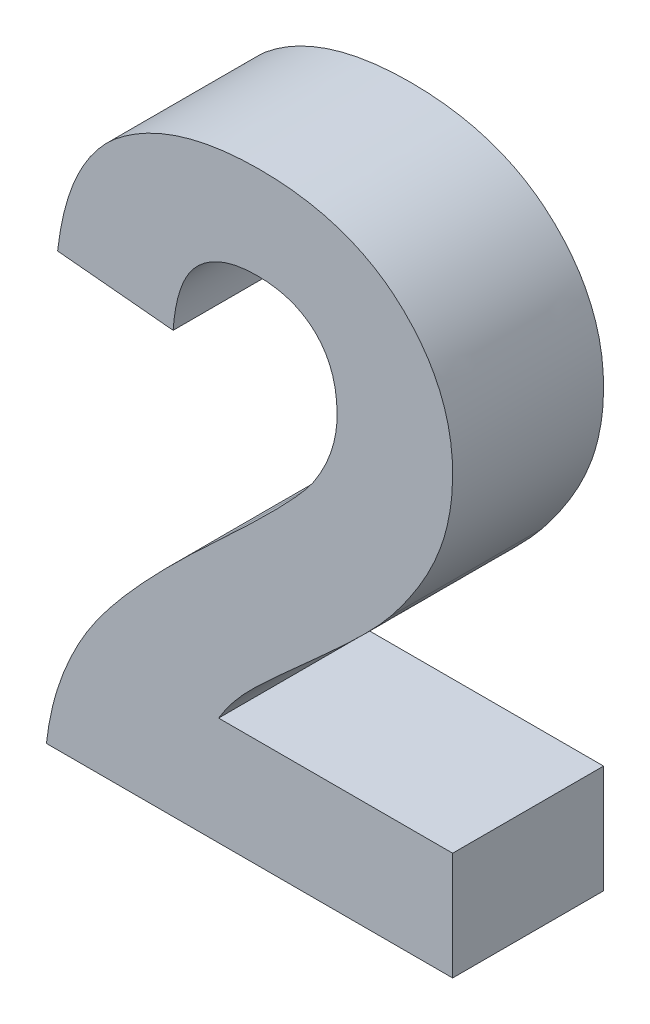
ISO-10303-21;
HEADER;
FILE_DESCRIPTION(('STEP AP214'),'2;1');
FILE_NAME('part.step','',(''),(''),'','','');
FILE_SCHEMA(('AUTOMOTIVE_DESIGN { 1 0 10303 214 1 1 1 1 }'));
ENDSEC;
DATA;
#1=APPLICATION_CONTEXT('core data for automotive mechanical design processes');
#2=APPLICATION_PROTOCOL_DEFINITION('international standard','automotive_design',2000,#1);
#3=PRODUCT_CONTEXT('',#1,'mechanical');
#4=PRODUCT('Part','Part','',(#3));
#5=PRODUCT_RELATED_PRODUCT_CATEGORY('part','',(#4));
#6=PRODUCT_DEFINITION_FORMATION('','',#4);
#7=PRODUCT_DEFINITION_CONTEXT('part definition',#1,'design');
#8=PRODUCT_DEFINITION('design','',#6,#7);
#9=PRODUCT_DEFINITION_SHAPE('','',#8);
#10=(LENGTH_UNIT() NAMED_UNIT(*) SI_UNIT(.MILLI.,.METRE.));
#11=(NAMED_UNIT(*) PLANE_ANGLE_UNIT() SI_UNIT($,.RADIAN.));
#12=(NAMED_UNIT(*) SI_UNIT($,.STERADIAN.) SOLID_ANGLE_UNIT());
#13=UNCERTAINTY_MEASURE_WITH_UNIT(LENGTH_MEASURE(1.E-05),#10,'distance_accuracy_value','');
#14=(GEOMETRIC_REPRESENTATION_CONTEXT(3) GLOBAL_UNCERTAINTY_ASSIGNED_CONTEXT((#13)) GLOBAL_UNIT_ASSIGNED_CONTEXT((#10,
#11,#12)) REPRESENTATION_CONTEXT('',''));
#15=CARTESIAN_POINT('',(0.,0.,0.));
#16=DIRECTION('',(0.,0.,1.));
#17=DIRECTION('',(1.,0.,0.));
#18=AXIS2_PLACEMENT_3D('',#15,#16,#17);
#19=CARTESIAN_POINT('',(-0.36557384071,0.120570176931,0.774985954115));
#20=DIRECTION('',(0.,0.,1.));
#21=DIRECTION('',(1.,0.,0.));
#22=AXIS2_PLACEMENT_3D('',#19,#20,#21);
#23=PLANE('',#22);
#24=DIRECTION('',(0.995540421021157,-0.0943359428479848,0.));
#25=VECTOR('',#24,1.);
#26=CARTESIAN_POINT('',(-0.281623223426,0.39958252261,0.774985954115));
#27=LINE('',#26,#25);
#28=CARTESIAN_POINT('',(-0.281623223426,0.39958252261,0.774985954115));
#29=VERTEX_POINT('',#28);
#30=CARTESIAN_POINT('',(-0.358166433303018,0.406835644351806,0.774985954115));
#31=VERTEX_POINT('',#30);
#32=EDGE_CURVE('E85',#29,#31,#27,.F.);
#33=ORIENTED_EDGE('',*,*,#32,.F.);
#34=CARTESIAN_POINT('',(-0.188876288653,0.35864889653,0.774985954115));
#35=CARTESIAN_POINT('',(-0.185589702861752,0.363542741767973,0.774985954115));
#36=CARTESIAN_POINT('',(-0.182625041832715,0.368731343442548,0.774985954115));
#37=CARTESIAN_POINT('',(-0.17772793674451,0.379545838210944,0.774985954115));
#38=CARTESIAN_POINT('',(-0.175792371443212,0.385170349040421,0.774985954115));
#39=CARTESIAN_POINT('',(-0.173711412476809,0.394893726242337,0.774985954115));
#40=CARTESIAN_POINT('',(-0.173192158147786,0.398907802936944,0.774985954115));
#41=CARTESIAN_POINT('',(-0.172954662833545,0.404944078867293,0.774985954115));
#42=CARTESIAN_POINT('',(-0.17296570515279,0.406958528183745,0.774985954115));
#43=CARTESIAN_POINT('',(-0.173121910214203,0.41098275578545,0.774985954115));
#44=CARTESIAN_POINT('',(-0.173267317941487,0.412992518814079,0.774985954115));
#45=CARTESIAN_POINT('',(-0.174175045306435,0.420897051151495,0.774985954115));
#46=CARTESIAN_POINT('',(-0.175586852863591,0.426769567860373,0.774985954115));
#47=CARTESIAN_POINT('',(-0.180095978161657,0.436584965377426,0.774985954115));
#48=CARTESIAN_POINT('',(-0.182835806045915,0.440684125447488,0.774985954115));
#49=CARTESIAN_POINT('',(-0.189551835271681,0.447699076554615,0.774985954115));
#50=CARTESIAN_POINT('',(-0.193528083964953,0.450614822260067,0.774985954115));
#51=CARTESIAN_POINT('',(-0.202249328406321,0.455094282886834,0.774985954115));
#52=CARTESIAN_POINT('',(-0.207007990791715,0.456630074200257,0.774985954115));
#53=CARTESIAN_POINT('',(-0.216028104793935,0.458385283782089,0.774985954115));
#54=CARTESIAN_POINT('',(-0.220265274570421,0.458759548771318,0.774985954115));
#55=CARTESIAN_POINT('',(-0.228756419771803,0.458901701535633,0.774985954115));
#56=CARTESIAN_POINT('',(-0.233010406561966,0.458669064595302,0.774985954115));
#57=CARTESIAN_POINT('',(-0.240106058682374,0.457597213989227,0.774985954115));
#58=CARTESIAN_POINT('',(-0.242977762173517,0.45696776468392,0.774985954115));
#59=CARTESIAN_POINT('',(-0.248581053737738,0.455256421258504,0.774985954115));
#60=CARTESIAN_POINT('',(-0.25131299520298,0.454175738762386,0.774985954115));
#61=CARTESIAN_POINT('',(-0.256141418358145,0.451724687376708,0.774985954115));
#62=CARTESIAN_POINT('',(-0.258272025804726,0.450421149519848,0.774985954115));
#63=CARTESIAN_POINT('',(-0.262305300863584,0.447500182795881,0.774985954115));
#64=CARTESIAN_POINT('',(-0.264208296394911,0.44588321451327,0.774985954115));
#65=CARTESIAN_POINT('',(-0.267679945346534,0.442310423195121,0.774985954115));
#66=CARTESIAN_POINT('',(-0.269247533536039,0.440353555293841,0.774985954115));
#67=CARTESIAN_POINT('',(-0.272027967175817,0.436203349786996,0.774985954115));
#68=CARTESIAN_POINT('',(-0.273240104938887,0.434009552181115,0.774985954115));
#69=CARTESIAN_POINT('',(-0.27597657660135,0.428173185550849,0.774985954115));
#70=CARTESIAN_POINT('',(-0.277275499397534,0.424427043165281,0.774985954115));
#71=CARTESIAN_POINT('',(-0.27933104714267,0.416789553094169,0.774985954115));
#72=CARTESIAN_POINT('',(-0.280085707400791,0.412897732166158,0.774985954115));
#73=CARTESIAN_POINT('',(-0.281082016095304,0.4058575165382,0.774985954115));
#74=CARTESIAN_POINT('',(-0.281396966366976,0.402719645084862,0.774985954115));
#75=CARTESIAN_POINT('',(-0.281623223426,0.39958252261,0.774985954115));
#76=B_SPLINE_CURVE_WITH_KNOTS('',3,(#34,#35,#36,#37,#38,#39,#40,#41,#42,#43,#44,#45,#46,#47,#48,
#49,#50,#51,#52,#53,#54,#55,#56,#57,#58,#59,#60,#61,#62,#63,#64,#65,#66,#67,#68,#69,#70,#71,#72,
#73,#74,#75),.UNSPECIFIED.,.F.,.F.,(4,2,2,2,2,2,2,2,2,2,2,2,2,2,2,2,2,2,2,2,4),(0.,
0.0177746503934266,0.0354950783032771,0.0475703062707295,0.0536069084304214,0.0596545387401188,
0.0774271803775426,0.0919332203113296,0.106439815857897,0.121233743906381,0.133945558705097,
0.146668367529293,0.155457798148315,0.164223778168004,0.17168828115672,0.179141897131568,
0.186618845002289,0.194110579643022,0.205938754382382,0.217809415875188,0.227255370992188),.UNSPECIFIED.);
#77=CARTESIAN_POINT('',(-0.188876288653,0.35864889653,0.774985954115));
#78=VERTEX_POINT('',#77);
#79=EDGE_CURVE('E142',#78,#29,#76,.T.);
#80=ORIENTED_EDGE('',*,*,#79,.F.);
#81=CARTESIAN_POINT('',(-0.188876288653,0.35864889653,0.774985954115));
#82=CARTESIAN_POINT('',(-0.200643255131,0.341442107584,0.774985954115));
#83=CARTESIAN_POINT('',(-0.252688011161,0.293101074096,0.774985954115));
#84=B_SPLINE_CURVE_WITH_KNOTS('',2,(#81,#82,#83),.UNSPECIFIED.,.F.,.F.,(3,3),(0.,1.),.UNSPECIFIED.);
#85=CARTESIAN_POINT('',(-0.252688011161,0.293101074096,0.774985954115));
#86=VERTEX_POINT('',#85);
#87=EDGE_CURVE('E116',#86,#78,#84,.F.);
#88=ORIENTED_EDGE('',*,*,#87,.F.);
#89=CARTESIAN_POINT('',(-0.36557384071,0.120570176931,0.774985954115));
#90=CARTESIAN_POINT('',(-0.364667384582419,0.129031177894083,0.774985954115));
#91=CARTESIAN_POINT('',(-0.363146663328493,0.13742679075891,0.774985954115));
#92=CARTESIAN_POINT('',(-0.358979270709723,0.153791402215748,0.774985954115));
#93=CARTESIAN_POINT('',(-0.356350965142496,0.161765072144572,0.774985954115));
#94=CARTESIAN_POINT('',(-0.351277857105274,0.174223991575376,0.774985954115));
#95=CARTESIAN_POINT('',(-0.349166790026085,0.178848793473012,0.774985954115));
#96=CARTESIAN_POINT('',(-0.344606821681253,0.187927335487042,0.774985954115));
#97=CARTESIAN_POINT('',(-0.342158091941201,0.192381160996639,0.774985954115));
#98=CARTESIAN_POINT('',(-0.336858255407474,0.201107552759572,0.774985954115));
#99=CARTESIAN_POINT('',(-0.334003144218437,0.205377685943886,0.774985954115));
#100=CARTESIAN_POINT('',(-0.328006443666915,0.213711889106658,0.774985954115));
#101=CARTESIAN_POINT('',(-0.32486466235471,0.21777581813845,0.774985954115));
#102=CARTESIAN_POINT('',(-0.316366205394076,0.22828800497123,0.774985954115));
#103=CARTESIAN_POINT('',(-0.310865431920654,0.234618654551614,0.774985954115));
#104=CARTESIAN_POINT('',(-0.299581933782532,0.247022870345501,0.774985954115));
#105=CARTESIAN_POINT('',(-0.293799114969163,0.253096349432275,0.774985954115));
#106=CARTESIAN_POINT('',(-0.282194882554107,0.264903761860366,0.774985954115));
#107=CARTESIAN_POINT('',(-0.276378234369198,0.270642406186143,0.774985954115));
#108=CARTESIAN_POINT('',(-0.26461870006764,0.281971295433976,0.774985954115));
#109=CARTESIAN_POINT('',(-0.258676016701179,0.287561750322356,0.774985954115));
#110=CARTESIAN_POINT('',(-0.252688011161,0.293101074096,0.774985954115));
#111=B_SPLINE_CURVE_WITH_KNOTS('',3,(#89,#90,#91,#92,#93,#94,#95,#96,#97,#98,#99,#100,#101,#102,
#103,#104,#105,#106,#107,#108,#109,#110),.UNSPECIFIED.,.F.,.F.,(4,2,2,2,2,2,2,2,2,2,4),(0.,
0.0255097818507253,0.0506122478899756,0.0658506058408331,0.0810812513455782,0.0964739649733538,
0.111877062028141,0.137022036570484,0.162175462904407,0.18668589693268,0.211159513144976),.UNSPECIFIED.);
#112=CARTESIAN_POINT('',(-0.36557384071,0.120570176931,0.774985954115));
#113=VERTEX_POINT('',#112);
#114=EDGE_CURVE('E120',#113,#86,#111,.T.);
#115=ORIENTED_EDGE('',*,*,#114,.F.);
#116=DIRECTION('',(1.,0.,0.));
#117=VECTOR('',#116,1.);
#118=CARTESIAN_POINT('',(-0.096438038241,0.120570176931,0.774985954115));
#119=LINE('',#118,#117);
#120=CARTESIAN_POINT('',(-0.096438038241,0.120570176931,0.774985954115));
#121=VERTEX_POINT('',#120);
#122=EDGE_CURVE('E121',#121,#113,#119,.F.);
#123=ORIENTED_EDGE('',*,*,#122,.F.);
#124=DIRECTION('',(0.,1.,0.));
#125=VECTOR('',#124,1.);
#126=CARTESIAN_POINT('',(-0.096438038241,0.192891164586,0.774985954115));
#127=LINE('',#126,#125);
#128=CARTESIAN_POINT('',(-0.096438038241,0.192175115203,0.774985954115));
#129=VERTEX_POINT('',#128);
#130=EDGE_CURVE('E209',#129,#121,#127,.F.);
#131=ORIENTED_EDGE('',*,*,#130,.F.);
#132=DIRECTION('',(1.,0.,0.));
#133=VECTOR('',#132,1.);
#134=CARTESIAN_POINT('',(-0.251492042934,0.192175115203,0.774985954115));
#135=LINE('',#134,#133);
#136=CARTESIAN_POINT('',(-0.251492042934,0.192175115203,0.774985954115));
#137=VERTEX_POINT('',#136);
#138=EDGE_CURVE('E95',#137,#129,#135,.T.);
#139=ORIENTED_EDGE('',*,*,#138,.F.);
#140=CARTESIAN_POINT('',(-0.137217340979,0.307954469746,0.774985954115));
#141=CARTESIAN_POINT('',(-0.139353037126449,0.305302944621707,0.774985954115));
#142=CARTESIAN_POINT('',(-0.141573984033531,0.302724988495581,0.774985954115));
#143=CARTESIAN_POINT('',(-0.146131511711208,0.297676439330239,0.774985954115));
#144=CARTESIAN_POINT('',(-0.148467998271846,0.295205761806673,0.774985954115));
#145=CARTESIAN_POINT('',(-0.155565497421837,0.287897688577217,0.774985954115));
#146=CARTESIAN_POINT('',(-0.16042259357215,0.283155038495497,0.774985954115));
#147=CARTESIAN_POINT('',(-0.170278945310958,0.27379810569811,0.774985954115));
#148=CARTESIAN_POINT('',(-0.175278506279473,0.269184148477099,0.774985954115));
#149=CARTESIAN_POINT('',(-0.185376284769084,0.260061611269294,0.774985954115));
#150=CARTESIAN_POINT('',(-0.190474545380619,0.255553079296312,0.774985954115));
#151=CARTESIAN_POINT('',(-0.200590264676539,0.246523141153975,0.774985954115));
#152=CARTESIAN_POINT('',(-0.205608043027328,0.242002094432728,0.774985954115));
#153=CARTESIAN_POINT('',(-0.215563854903044,0.232901332278707,0.774985954115));
#154=CARTESIAN_POINT('',(-0.22050207282398,0.228321817295899,0.774985954115));
#155=CARTESIAN_POINT('',(-0.227837458837521,0.221311740510132,0.774985954115));
#156=CARTESIAN_POINT('',(-0.230285518263557,0.218936435106826,0.774985954115));
#157=CARTESIAN_POINT('',(-0.235016558380739,0.214030305329173,0.774985954115));
#158=CARTESIAN_POINT('',(-0.237299738582315,0.211499676006443,0.774985954115));
#159=CARTESIAN_POINT('',(-0.241704508147743,0.20627580460931,0.774985954115));
#160=CARTESIAN_POINT('',(-0.243825108410007,0.203581722249152,0.774985954115));
#161=CARTESIAN_POINT('',(-0.247843563115589,0.198014772068167,0.774985954115));
#162=CARTESIAN_POINT('',(-0.249740376054295,0.19514115669326,0.774985954115));
#163=CARTESIAN_POINT('',(-0.251492042934,0.192175115203,0.774985954115));
#164=B_SPLINE_CURVE_WITH_KNOTS('',3,(#140,#141,#142,#143,#144,#145,#146,#147,#148,#149,#150,
#151,#152,#153,#154,#155,#156,#157,#158,#159,#160,#161,#162,#163),.UNSPECIFIED.,.F.,.F.,(4,2,2,
2,2,2,2,2,2,2,2,4),(0.,0.0102067234519945,0.0204052574232418,0.0407657022062056,
0.0611736749463013,0.0815907678655827,0.101852392300577,0.122057107539589,0.132286882400719,
0.14250406388161,0.152779148431626,0.163100309649479),.UNSPECIFIED.);
#165=CARTESIAN_POINT('',(-0.137217340979,0.307954469746,0.774985954115));
#166=VERTEX_POINT('',#165);
#167=EDGE_CURVE('E90',#166,#137,#164,.T.);
#168=ORIENTED_EDGE('',*,*,#167,.F.);
#169=CARTESIAN_POINT('',(-0.358166433303,0.406835644352,0.774985954115));
#170=CARTESIAN_POINT('',(-0.357274320731919,0.414508141733941,0.774985954115));
#171=CARTESIAN_POINT('',(-0.356028449364086,0.422171133298528,0.774985954115));
#172=CARTESIAN_POINT('',(-0.352458011950835,0.43739267305568,0.774985954115));
#173=CARTESIAN_POINT('',(-0.350112554253337,0.444946140376936,0.774985954115));
#174=CARTESIAN_POINT('',(-0.342707409026286,0.462567547911918,0.774985954115));
#175=CARTESIAN_POINT('',(-0.336925339882253,0.472378476522852,0.774985954115));
#176=CARTESIAN_POINT('',(-0.325855035516939,0.485024974095456,0.774985954115));
#177=CARTESIAN_POINT('',(-0.321750380110586,0.488903490297805,0.774985954115));
#178=CARTESIAN_POINT('',(-0.315102735789036,0.494096822483654,0.774985954115));
#179=CARTESIAN_POINT('',(-0.312798748714876,0.495727120757227,0.774985954115));
#180=CARTESIAN_POINT('',(-0.308092738313976,0.498840708754562,0.774985954115));
#181=CARTESIAN_POINT('',(-0.305690654478325,0.500323905747722,0.774985954115));
#182=CARTESIAN_POINT('',(-0.296645714686045,0.50549222358439,0.774985954115));
#183=CARTESIAN_POINT('',(-0.289698580014893,0.508660962085526,0.774985954115));
#184=CARTESIAN_POINT('',(-0.275385502296338,0.513815346973194,0.774985954115));
#185=CARTESIAN_POINT('',(-0.26801912052199,0.515799728077219,0.774985954115));
#186=CARTESIAN_POINT('',(-0.24986810330119,0.519337213250019,0.774985954115));
#187=CARTESIAN_POINT('',(-0.238980366111582,0.520334517696455,0.774985954115));
#188=CARTESIAN_POINT('',(-0.21716397788362,0.520741330185675,0.774985954115));
#189=CARTESIAN_POINT('',(-0.206235291195724,0.520148656359159,0.774985954115));
#190=CARTESIAN_POINT('',(-0.18860352399492,0.517447375329287,0.774985954115));
#191=CARTESIAN_POINT('',(-0.181810183776046,0.515969018390912,0.774985954115));
#192=CARTESIAN_POINT('',(-0.168558877943147,0.511974963279137,0.774985954115));
#193=CARTESIAN_POINT('',(-0.162099470663266,0.509464233252727,0.774985954115));
#194=CARTESIAN_POINT('',(-0.149676421548791,0.503266917911936,0.774985954115));
#195=CARTESIAN_POINT('',(-0.143718496143394,0.499568622345076,0.774985954115));
#196=CARTESIAN_POINT('',(-0.13263121275102,0.491060125198296,0.774985954115));
#197=CARTESIAN_POINT('',(-0.127504787249947,0.486246127796553,0.774985954115));
#198=CARTESIAN_POINT('',(-0.118695484880733,0.476351111912834,0.774985954115));
#199=CARTESIAN_POINT('',(-0.11491642322682,0.471355379459069,0.774985954115));
#200=CARTESIAN_POINT('',(-0.108369573781325,0.460758041189623,0.774985954115));
#201=CARTESIAN_POINT('',(-0.105597636581869,0.45515904748678,0.774985954115));
#202=CARTESIAN_POINT('',(-0.10131602800064,0.443966928540537,0.774985954115));
#203=CARTESIAN_POINT('',(-0.0997293313325957,0.438402883509035,0.774985954115));
#204=CARTESIAN_POINT('',(-0.097482979633555,0.427075507942627,0.774985954115));
#205=CARTESIAN_POINT('',(-0.0968269518996219,0.42131148686526,0.774985954115));
#206=CARTESIAN_POINT('',(-0.0962070475764187,0.407844956053679,0.774985954115));
#207=CARTESIAN_POINT('',(-0.0965427414227697,0.400129981504694,0.774985954115));
#208=CARTESIAN_POINT('',(-0.098458543967096,0.384871878356709,0.774985954115));
#209=CARTESIAN_POINT('',(-0.10003582236597,0.377328399010431,0.774985954115));
#210=CARTESIAN_POINT('',(-0.104487358270996,0.362712494628641,0.774985954115));
#211=CARTESIAN_POINT('',(-0.107349468411992,0.355636353943096,0.774985954115));
#212=CARTESIAN_POINT('',(-0.114031914270733,0.341950034215567,0.774985954115));
#213=CARTESIAN_POINT('',(-0.117855115019025,0.335341325451502,0.774985954115));
#214=CARTESIAN_POINT('',(-0.126722406687794,0.321691653168915,0.774985954115));
#215=CARTESIAN_POINT('',(-0.131861399164247,0.314711105736189,0.774985954115));
#216=CARTESIAN_POINT('',(-0.137217340979,0.307954469746,0.774985954115));
#217=B_SPLINE_CURVE_WITH_KNOTS('',3,(#169,#170,#171,#172,#173,#174,#175,#176,#177,#178,#179,
#180,#181,#182,#183,#184,#185,#186,#187,#188,#189,#190,#191,#192,#193,#194,#195,#196,#197,#198,
#199,#200,#201,#202,#203,#204,#205,#206,#207,#208,#209,#210,#211,#212,#213,#214,#215,#216),
.UNSPECIFIED.,.F.,.F.,(4,2,2,2,2,2,2,2,2,2,2,2,2,2,2,2,2,2,2,2,2,2,2,4),(0.,0.0232026537197568,
0.0468652142923629,0.0803453545951219,0.0971808176899543,0.105640617517325,0.114105716833138,
0.136881273310884,0.159681118207872,0.192321512261158,0.225006720442495,0.245795795085203,
0.26648597489521,0.287386785125338,0.308359775586516,0.327062916055309,0.34568810051514,
0.362961204816329,0.380301448077633,0.403359642397387,0.426365425260616,0.449158138305193,
0.472019619768483,0.497938936580274),.UNSPECIFIED.);
#218=EDGE_CURVE('E23',#31,#166,#217,.T.);
#219=ORIENTED_EDGE('',*,*,#218,.F.);
#220=EDGE_LOOP('',(#33,#80,#88,#115,#123,#131,#139,#168,#219));
#221=FACE_BOUND('',#220,.T.);
#222=ADVANCED_FACE('F16',(#221),#23,.T.);
#223=CARTESIAN_POINT('',(-0.281623223426,0.39958252261,0.674985954115));
#224=DIRECTION('',(-0.0943359428479848,-0.995540421021157,0.));
#225=DIRECTION('',(0.995540421021157,-0.0943359428479848,0.));
#226=AXIS2_PLACEMENT_3D('',#223,#224,#225);
#227=PLANE('',#226);
#228=DIRECTION('',(0.,0.,1.));
#229=VECTOR('',#228,1.);
#230=CARTESIAN_POINT('',(-0.358166433303,0.406835644352,0.724985954115));
#231=LINE('',#230,#229);
#232=CARTESIAN_POINT('',(-0.358166433303,0.406835644352,0.674985954115));
#233=VERTEX_POINT('',#232);
#234=EDGE_CURVE('E104',#233,#31,#231,.T.);
#235=ORIENTED_EDGE('',*,*,#234,.F.);
#236=DIRECTION('',(-0.995540421020678,0.0943359428530403,0.));
#237=VECTOR('',#236,1.);
#238=CARTESIAN_POINT('',(-0.281623223426,0.39958252261,0.674985954115));
#239=LINE('',#238,#237);
#240=CARTESIAN_POINT('',(-0.281623223426,0.39958252261,0.674985954115));
#241=VERTEX_POINT('',#240);
#242=EDGE_CURVE('E238',#241,#233,#239,.T.);
#243=ORIENTED_EDGE('',*,*,#242,.F.);
#244=DIRECTION('',(0.,0.,-1.));
#245=VECTOR('',#244,1.);
#246=CARTESIAN_POINT('',(-0.281623223426,0.39958252261,0.724985954115));
#247=LINE('',#246,#245);
#248=EDGE_CURVE('E239',#29,#241,#247,.T.);
#249=ORIENTED_EDGE('',*,*,#248,.F.);
#250=ORIENTED_EDGE('',*,*,#32,.T.);
#251=EDGE_LOOP('',(#235,#243,#249,#250));
#252=FACE_BOUND('',#251,.T.);
#253=ADVANCED_FACE('F131',(#252),#227,.T.);
#254=CARTESIAN_POINT('',(-0.358166433303,0.406835644352,0.674985954115));
#255=CARTESIAN_POINT('',(-0.351299119917,0.467638099359,0.674985954115));
#256=CARTESIAN_POINT('',(-0.315014409175,0.494104138145,0.674985954115));
#257=CARTESIAN_POINT('',(-0.278729698432,0.520570176931,0.674985954115));
#258=CARTESIAN_POINT('',(-0.224292968271,0.520570176931,0.674985954115));
#259=CARTESIAN_POINT('',(-0.16460931982,0.520570176931,0.674985954115));
#260=CARTESIAN_POINT('',(-0.13052367903,0.488837929437,0.674985954115));
#261=CARTESIAN_POINT('',(-0.096438038241,0.457105681944,0.674985954115));
#262=CARTESIAN_POINT('',(-0.096438038241,0.409922035847,0.674985954115));
#263=CARTESIAN_POINT('',(-0.096438038241,0.383070188705,0.674985954115));
#264=CARTESIAN_POINT('',(-0.106218129362,0.358803219872,0.674985954115));
#265=CARTESIAN_POINT('',(-0.115998220483,0.334536251039,0.674985954115));
#266=CARTESIAN_POINT('',(-0.137217340979,0.307954469746,0.674985954115));
#267=CARTESIAN_POINT('',(-0.358166433303,0.406835644352,0.774985954115));
#268=CARTESIAN_POINT('',(-0.351299119917,0.467638099359,0.774985954115));
#269=CARTESIAN_POINT('',(-0.315014409175,0.494104138145,0.774985954115));
#270=CARTESIAN_POINT('',(-0.278729698432,0.520570176931,0.774985954115));
#271=CARTESIAN_POINT('',(-0.224292968271,0.520570176931,0.774985954115));
#272=CARTESIAN_POINT('',(-0.16460931982,0.520570176931,0.774985954115));
#273=CARTESIAN_POINT('',(-0.13052367903,0.488837929437,0.774985954115));
#274=CARTESIAN_POINT('',(-0.096438038241,0.457105681944,0.774985954115));
#275=CARTESIAN_POINT('',(-0.096438038241,0.409922035847,0.774985954115));
#276=CARTESIAN_POINT('',(-0.096438038241,0.383070188705,0.774985954115));
#277=CARTESIAN_POINT('',(-0.106218129362,0.358803219872,0.774985954115));
#278=CARTESIAN_POINT('',(-0.115998220483,0.334536251039,0.774985954115));
#279=CARTESIAN_POINT('',(-0.137217340979,0.307954469746,0.774985954115));
#280=B_SPLINE_SURFACE_WITH_KNOTS('',1,2,((#254,#255,#256,#257,#258,#259,#260,#261,#262,#263,
#264,#265,#266),(#267,#268,#269,#270,#271,#272,#273,#274,#275,#276,#277,#278,#279)),
.UNSPECIFIED.,.F.,.F.,.F.,(2,2),(3,2,2,2,2,2,3),(0.,0.1),(11.,12.,13.,14.,15.,16.,17.),.UNSPECIFIED.);
#281=DIRECTION('',(0.,0.,1.));
#282=VECTOR('',#281,1.);
#283=CARTESIAN_POINT('',(-0.137217340979,0.307954469746,0.724985954115));
#284=LINE('',#283,#282);
#285=CARTESIAN_POINT('',(-0.137217340979,0.307954469746,0.674985954115));
#286=VERTEX_POINT('',#285);
#287=EDGE_CURVE('E99',#286,#166,#284,.T.);
#288=CARTESIAN_POINT('',(-0.358166433303,0.406835644352,0.674985954115));
#289=CARTESIAN_POINT('',(-0.357274320731919,0.414508141733941,0.674985954115));
#290=CARTESIAN_POINT('',(-0.356028449364086,0.422171133298528,0.674985954115));
#291=CARTESIAN_POINT('',(-0.352458011950835,0.43739267305568,0.674985954115));
#292=CARTESIAN_POINT('',(-0.350112554253337,0.444946140376936,0.674985954115));
#293=CARTESIAN_POINT('',(-0.342707409026286,0.462567547911918,0.674985954115));
#294=CARTESIAN_POINT('',(-0.336925339882253,0.472378476522852,0.674985954115));
#295=CARTESIAN_POINT('',(-0.325855035516939,0.485024974095456,0.674985954115));
#296=CARTESIAN_POINT('',(-0.321750380110586,0.488903490297805,0.674985954115));
#297=CARTESIAN_POINT('',(-0.315102735789036,0.494096822483654,0.674985954115));
#298=CARTESIAN_POINT('',(-0.312798748714876,0.495727120757227,0.674985954115));
#299=CARTESIAN_POINT('',(-0.308092738313976,0.498840708754562,0.674985954115));
#300=CARTESIAN_POINT('',(-0.305690654478325,0.500323905747722,0.674985954115));
#301=CARTESIAN_POINT('',(-0.296645714686045,0.50549222358439,0.674985954115));
#302=CARTESIAN_POINT('',(-0.289698580014893,0.508660962085526,0.674985954115));
#303=CARTESIAN_POINT('',(-0.275385502296338,0.513815346973194,0.674985954115));
#304=CARTESIAN_POINT('',(-0.26801912052199,0.515799728077219,0.674985954115));
#305=CARTESIAN_POINT('',(-0.24986810330119,0.519337213250019,0.674985954115));
#306=CARTESIAN_POINT('',(-0.238980366111582,0.520334517696455,0.674985954115));
#307=CARTESIAN_POINT('',(-0.21716397788362,0.520741330185675,0.674985954115));
#308=CARTESIAN_POINT('',(-0.206235291195724,0.520148656359159,0.674985954115));
#309=CARTESIAN_POINT('',(-0.18860352399492,0.517447375329287,0.674985954115));
#310=CARTESIAN_POINT('',(-0.181810183776046,0.515969018390912,0.674985954115));
#311=CARTESIAN_POINT('',(-0.168558877943147,0.511974963279137,0.674985954115));
#312=CARTESIAN_POINT('',(-0.162099470663266,0.509464233252727,0.674985954115));
#313=CARTESIAN_POINT('',(-0.149676421548791,0.503266917911936,0.674985954115));
#314=CARTESIAN_POINT('',(-0.143718496143394,0.499568622345076,0.674985954115));
#315=CARTESIAN_POINT('',(-0.13263121275102,0.491060125198296,0.674985954115));
#316=CARTESIAN_POINT('',(-0.127504787249947,0.486246127796553,0.674985954115));
#317=CARTESIAN_POINT('',(-0.118695484880733,0.476351111912834,0.674985954115));
#318=CARTESIAN_POINT('',(-0.11491642322682,0.471355379459069,0.674985954115));
#319=CARTESIAN_POINT('',(-0.108369573781325,0.460758041189623,0.674985954115));
#320=CARTESIAN_POINT('',(-0.105597636581869,0.45515904748678,0.674985954115));
#321=CARTESIAN_POINT('',(-0.10131602800064,0.443966928540537,0.674985954115));
#322=CARTESIAN_POINT('',(-0.0997293313325957,0.438402883509035,0.674985954115));
#323=CARTESIAN_POINT('',(-0.097482979633555,0.427075507942627,0.674985954115));
#324=CARTESIAN_POINT('',(-0.0968269518996219,0.42131148686526,0.674985954115));
#325=CARTESIAN_POINT('',(-0.0962070475764187,0.407844956053679,0.674985954115));
#326=CARTESIAN_POINT('',(-0.0965427414227697,0.400129981504694,0.674985954115));
#327=CARTESIAN_POINT('',(-0.098458543967096,0.384871878356709,0.674985954115));
#328=CARTESIAN_POINT('',(-0.10003582236597,0.377328399010431,0.674985954115));
#329=CARTESIAN_POINT('',(-0.104487358270996,0.362712494628641,0.674985954115));
#330=CARTESIAN_POINT('',(-0.107349468411992,0.355636353943096,0.674985954115));
#331=CARTESIAN_POINT('',(-0.114031914270733,0.341950034215567,0.674985954115));
#332=CARTESIAN_POINT('',(-0.117855115019025,0.335341325451502,0.674985954115));
#333=CARTESIAN_POINT('',(-0.126722406687794,0.321691653168915,0.674985954115));
#334=CARTESIAN_POINT('',(-0.131861399164247,0.314711105736189,0.674985954115));
#335=CARTESIAN_POINT('',(-0.137217340979,0.307954469746,0.674985954115));
#336=B_SPLINE_CURVE_WITH_KNOTS('',3,(#288,#289,#290,#291,#292,#293,#294,#295,#296,#297,#298,
#299,#300,#301,#302,#303,#304,#305,#306,#307,#308,#309,#310,#311,#312,#313,#314,#315,#316,#317,
#318,#319,#320,#321,#322,#323,#324,#325,#326,#327,#328,#329,#330,#331,#332,#333,#334,#335),
.UNSPECIFIED.,.F.,.F.,(4,2,2,2,2,2,2,2,2,2,2,2,2,2,2,2,2,2,2,2,2,2,2,4),(0.,0.0232026537197568,
0.0468652142923629,0.0803453545951219,0.0971808176899543,0.105640617517325,0.114105716833138,
0.136881273310884,0.159681118207872,0.192321512261158,0.225006720442495,0.245795795085203,
0.26648597489521,0.287386785125338,0.308359775586516,0.327062916055309,0.34568810051514,
0.362961204816329,0.380301448077633,0.403359642397387,0.426365425260616,0.449158138305193,
0.472019619768483,0.497938936580274),.UNSPECIFIED.);
#337=EDGE_CURVE('E177',#233,#286,#336,.T.);
#338=ORIENTED_EDGE('',*,*,#287,.F.);
#339=ORIENTED_EDGE('',*,*,#337,.F.);
#340=ORIENTED_EDGE('',*,*,#234,.T.);
#341=ORIENTED_EDGE('',*,*,#218,.T.);
#342=EDGE_LOOP('',(#338,#339,#340,#341));
#343=FACE_BOUND('',#342,.T.);
#344=ADVANCED_FACE('F101',(#343),#280,.T.);
#345=CARTESIAN_POINT('',(-0.137217340979,0.307954469746,0.674985954115));
#346=CARTESIAN_POINT('',(-0.151299119917,0.290323291608,0.674985954115));
#347=CARTESIAN_POINT('',(-0.188567641968,0.257240733707,0.674985954115));
#348=CARTESIAN_POINT('',(-0.225836164019,0.224158175805,0.674985954115));
#349=CARTESIAN_POINT('',(-0.235635545557,0.213317111705,0.674985954115));
#350=CARTESIAN_POINT('',(-0.245434927096,0.202476047604,0.674985954115));
#351=CARTESIAN_POINT('',(-0.251492042934,0.192175115203,0.674985954115));
#352=CARTESIAN_POINT('',(-0.137217340979,0.307954469746,0.774985954115));
#353=CARTESIAN_POINT('',(-0.151299119917,0.290323291608,0.774985954115));
#354=CARTESIAN_POINT('',(-0.188567641968,0.257240733707,0.774985954115));
#355=CARTESIAN_POINT('',(-0.225836164019,0.224158175805,0.774985954115));
#356=CARTESIAN_POINT('',(-0.235635545557,0.213317111705,0.774985954115));
#357=CARTESIAN_POINT('',(-0.245434927096,0.202476047604,0.774985954115));
#358=CARTESIAN_POINT('',(-0.251492042934,0.192175115203,0.774985954115));
#359=B_SPLINE_SURFACE_WITH_KNOTS('',1,2,((#345,#346,#347,#348,#349,#350,#351),(#352,#353,#354,
#355,#356,#357,#358)),.UNSPECIFIED.,.F.,.F.,.F.,(2,2),(3,2,2,3),(0.,0.1),(17.,18.,19.,20.),.UNSPECIFIED.);
#360=CARTESIAN_POINT('',(-0.137217340979,0.307954469746,0.674985954115));
#361=CARTESIAN_POINT('',(-0.139353037126449,0.305302944621707,0.674985954115));
#362=CARTESIAN_POINT('',(-0.141573984033531,0.302724988495581,0.674985954115));
#363=CARTESIAN_POINT('',(-0.146131511711208,0.297676439330239,0.674985954115));
#364=CARTESIAN_POINT('',(-0.148467998271846,0.295205761806673,0.674985954115));
#365=CARTESIAN_POINT('',(-0.155565497421837,0.287897688577217,0.674985954115));
#366=CARTESIAN_POINT('',(-0.16042259357215,0.283155038495497,0.674985954115));
#367=CARTESIAN_POINT('',(-0.170278945310958,0.27379810569811,0.674985954115));
#368=CARTESIAN_POINT('',(-0.175278506279473,0.269184148477099,0.674985954115));
#369=CARTESIAN_POINT('',(-0.185376284769084,0.260061611269294,0.674985954115));
#370=CARTESIAN_POINT('',(-0.190474545380619,0.255553079296312,0.674985954115));
#371=CARTESIAN_POINT('',(-0.200590264676539,0.246523141153975,0.674985954115));
#372=CARTESIAN_POINT('',(-0.205608043027328,0.242002094432728,0.674985954115));
#373=CARTESIAN_POINT('',(-0.215563854903044,0.232901332278707,0.674985954115));
#374=CARTESIAN_POINT('',(-0.22050207282398,0.228321817295899,0.674985954115));
#375=CARTESIAN_POINT('',(-0.227837458837521,0.221311740510132,0.674985954115));
#376=CARTESIAN_POINT('',(-0.230285518263557,0.218936435106826,0.674985954115));
#377=CARTESIAN_POINT('',(-0.235016558380739,0.214030305329173,0.674985954115));
#378=CARTESIAN_POINT('',(-0.237299738582315,0.211499676006443,0.674985954115));
#379=CARTESIAN_POINT('',(-0.241704508147743,0.20627580460931,0.674985954115));
#380=CARTESIAN_POINT('',(-0.243825108410007,0.203581722249151,0.674985954115));
#381=CARTESIAN_POINT('',(-0.247843563115589,0.198014772068167,0.674985954115));
#382=CARTESIAN_POINT('',(-0.249740376054295,0.19514115669326,0.674985954115));
#383=CARTESIAN_POINT('',(-0.251492042934,0.192175115203,0.674985954115));
#384=B_SPLINE_CURVE_WITH_KNOTS('',3,(#360,#361,#362,#363,#364,#365,#366,#367,#368,#369,#370,
#371,#372,#373,#374,#375,#376,#377,#378,#379,#380,#381,#382,#383),.UNSPECIFIED.,.F.,.F.,(4,2,2,
2,2,2,2,2,2,2,2,4),(0.,0.0102067234519945,0.0204052574232418,0.0407657022062056,
0.0611736749463013,0.0815907678655827,0.101852392300577,0.122057107539589,0.132286882400719,
0.14250406388161,0.152779148431626,0.163100309649479),.UNSPECIFIED.);
#385=CARTESIAN_POINT('',(-0.251492042934,0.192175115203,0.674985954115));
#386=VERTEX_POINT('',#385);
#387=EDGE_CURVE('E107',#286,#386,#384,.T.);
#388=DIRECTION('',(0.,0.,1.));
#389=VECTOR('',#388,1.);
#390=CARTESIAN_POINT('',(-0.251492042934,0.192175115203,0.674985954115));
#391=LINE('',#390,#389);
#392=EDGE_CURVE('E109',#386,#137,#391,.T.);
#393=ORIENTED_EDGE('',*,*,#387,.F.);
#394=ORIENTED_EDGE('',*,*,#287,.T.);
#395=ORIENTED_EDGE('',*,*,#167,.T.);
#396=ORIENTED_EDGE('',*,*,#392,.F.);
#397=EDGE_LOOP('',(#393,#394,#395,#396));
#398=FACE_BOUND('',#397,.T.);
#399=ADVANCED_FACE('F105',(#398),#359,.T.);
#400=CARTESIAN_POINT('',(-0.251492042934,0.192175115203,0.674985954115));
#401=DIRECTION('',(0.,1.,0.));
#402=DIRECTION('',(0.,0.,1.));
#403=AXIS2_PLACEMENT_3D('',#400,#401,#402);
#404=PLANE('',#403);
#405=DIRECTION('',(0.,0.,-1.));
#406=VECTOR('',#405,1.);
#407=CARTESIAN_POINT('',(-0.096438038241,0.192175115203,0.674985954115));
#408=LINE('',#407,#406);
#409=CARTESIAN_POINT('',(-0.096438038241,0.192175115203,0.674985954115));
#410=VERTEX_POINT('',#409);
#411=EDGE_CURVE('E206',#410,#129,#408,.F.);
#412=ORIENTED_EDGE('',*,*,#411,.F.);
#413=DIRECTION('',(-1.,0.,0.));
#414=VECTOR('',#413,1.);
#415=CARTESIAN_POINT('',(-0.36557384071,0.192175115203,0.674985954115));
#416=LINE('',#415,#414);
#417=EDGE_CURVE('E176',#386,#410,#416,.F.);
#418=ORIENTED_EDGE('',*,*,#417,.F.);
#419=ORIENTED_EDGE('',*,*,#392,.T.);
#420=ORIENTED_EDGE('',*,*,#138,.T.);
#421=EDGE_LOOP('',(#412,#418,#419,#420));
#422=FACE_BOUND('',#421,.T.);
#423=ADVANCED_FACE('F159',(#422),#404,.T.);
#424=CARTESIAN_POINT('',(-0.096438038241,0.192891164586,0.674985954115));
#425=DIRECTION('',(1.,0.,0.));
#426=DIRECTION('',(0.,0.,-1.));
#427=AXIS2_PLACEMENT_3D('',#424,#425,#426);
#428=PLANE('',#427);
#429=DIRECTION('',(0.,0.,-1.));
#430=VECTOR('',#429,1.);
#431=CARTESIAN_POINT('',(-0.096438038241,0.120570176931,0.674985954115));
#432=LINE('',#431,#430);
#433=CARTESIAN_POINT('',(-0.096438038241,0.120570176931,0.674985954115));
#434=VERTEX_POINT('',#433);
#435=EDGE_CURVE('E211',#434,#121,#432,.F.);
#436=ORIENTED_EDGE('',*,*,#435,.F.);
#437=DIRECTION('',(0.,1.,0.));
#438=VECTOR('',#437,1.);
#439=CARTESIAN_POINT('',(-0.096438038241,0.120570176931,0.674985954115));
#440=LINE('',#439,#438);
#441=EDGE_CURVE('E226',#410,#434,#440,.F.);
#442=ORIENTED_EDGE('',*,*,#441,.F.);
#443=ORIENTED_EDGE('',*,*,#411,.T.);
#444=ORIENTED_EDGE('',*,*,#130,.T.);
#445=EDGE_LOOP('',(#436,#442,#443,#444));
#446=FACE_BOUND('',#445,.T.);
#447=ADVANCED_FACE('F264',(#446),#428,.T.);
#448=CARTESIAN_POINT('',(-0.096438038241,0.120570176931,0.674985954115));
#449=DIRECTION('',(0.,-1.,0.));
#450=DIRECTION('',(0.,0.,-1.));
#451=AXIS2_PLACEMENT_3D('',#448,#449,#450);
#452=PLANE('',#451);
#453=DIRECTION('',(0.,0.,1.));
#454=VECTOR('',#453,1.);
#455=CARTESIAN_POINT('',(-0.36557384071,0.120570176931,0.724985954115));
#456=LINE('',#455,#454);
#457=CARTESIAN_POINT('',(-0.36557384071,0.120570176931,0.674985954115));
#458=VERTEX_POINT('',#457);
#459=EDGE_CURVE('E232',#458,#113,#456,.T.);
#460=ORIENTED_EDGE('',*,*,#459,.F.);
#461=DIRECTION('',(-1.,0.,0.));
#462=VECTOR('',#461,1.);
#463=CARTESIAN_POINT('',(-0.36557384071,0.120570176931,0.674985954115));
#464=LINE('',#463,#462);
#465=EDGE_CURVE('E229',#434,#458,#464,.T.);
#466=ORIENTED_EDGE('',*,*,#465,.F.);
#467=ORIENTED_EDGE('',*,*,#435,.T.);
#468=ORIENTED_EDGE('',*,*,#122,.T.);
#469=EDGE_LOOP('',(#460,#466,#467,#468));
#470=FACE_BOUND('',#469,.T.);
#471=ADVANCED_FACE('F190',(#470),#452,.T.);
#472=CARTESIAN_POINT('',(-0.36557384071,0.120570176931,0.674985954115));
#473=CARTESIAN_POINT('',(-0.361175663127,0.16096370899,0.674985954115));
#474=CARTESIAN_POINT('',(-0.33926208759,0.197151986482,0.674985954115));
#475=CARTESIAN_POINT('',(-0.317348512052,0.233340263974,0.674985954115));
#476=CARTESIAN_POINT('',(-0.252688011161,0.293101074096,0.674985954115));
#477=CARTESIAN_POINT('',(-0.36557384071,0.120570176931,0.774985954115));
#478=CARTESIAN_POINT('',(-0.361175663127,0.16096370899,0.774985954115));
#479=CARTESIAN_POINT('',(-0.33926208759,0.197151986482,0.774985954115));
#480=CARTESIAN_POINT('',(-0.317348512052,0.233340263974,0.774985954115));
#481=CARTESIAN_POINT('',(-0.252688011161,0.293101074096,0.774985954115));
#482=B_SPLINE_SURFACE_WITH_KNOTS('',1,2,((#472,#473,#474,#475,#476),(#477,#478,#479,#480,#481)),
.UNSPECIFIED.,.F.,.F.,.F.,(2,2),(3,2,3),(0.,0.1),(2.,3.,4.),.UNSPECIFIED.);
#483=DIRECTION('',(0.,0.,1.));
#484=VECTOR('',#483,1.);
#485=CARTESIAN_POINT('',(-0.252688011161,0.293101074096,0.724985954115));
#486=LINE('',#485,#484);
#487=CARTESIAN_POINT('',(-0.252688011161,0.293101074096,0.674985954115));
#488=VERTEX_POINT('',#487);
#489=EDGE_CURVE('E119',#488,#86,#486,.T.);
#490=CARTESIAN_POINT('',(-0.36557384071,0.120570176931,0.674985954115));
#491=CARTESIAN_POINT('',(-0.364667384582419,0.129031177894083,0.674985954115));
#492=CARTESIAN_POINT('',(-0.363146663328493,0.13742679075891,0.674985954115));
#493=CARTESIAN_POINT('',(-0.358979270709723,0.153791402215748,0.674985954115));
#494=CARTESIAN_POINT('',(-0.356350965142496,0.161765072144572,0.674985954115));
#495=CARTESIAN_POINT('',(-0.351277857105274,0.174223991575376,0.674985954115));
#496=CARTESIAN_POINT('',(-0.349166790026085,0.178848793473012,0.674985954115));
#497=CARTESIAN_POINT('',(-0.344606821681253,0.187927335487042,0.674985954115));
#498=CARTESIAN_POINT('',(-0.342158091941202,0.192381160996639,0.674985954115));
#499=CARTESIAN_POINT('',(-0.336858255407474,0.201107552759572,0.674985954115));
#500=CARTESIAN_POINT('',(-0.334003144218437,0.205377685943886,0.674985954115));
#501=CARTESIAN_POINT('',(-0.328006443666915,0.213711889106658,0.674985954115));
#502=CARTESIAN_POINT('',(-0.32486466235471,0.21777581813845,0.674985954115));
#503=CARTESIAN_POINT('',(-0.316366205394076,0.22828800497123,0.674985954115));
#504=CARTESIAN_POINT('',(-0.310865431920654,0.234618654551614,0.674985954115));
#505=CARTESIAN_POINT('',(-0.299581933782532,0.247022870345501,0.674985954115));
#506=CARTESIAN_POINT('',(-0.293799114969163,0.253096349432275,0.674985954115));
#507=CARTESIAN_POINT('',(-0.282194882554107,0.264903761860366,0.674985954115));
#508=CARTESIAN_POINT('',(-0.276378234369198,0.270642406186143,0.674985954115));
#509=CARTESIAN_POINT('',(-0.26461870006764,0.281971295433976,0.674985954115));
#510=CARTESIAN_POINT('',(-0.258676016701179,0.287561750322356,0.674985954115));
#511=CARTESIAN_POINT('',(-0.252688011161,0.293101074096,0.674985954115));
#512=B_SPLINE_CURVE_WITH_KNOTS('',3,(#490,#491,#492,#493,#494,#495,#496,#497,#498,#499,#500,
#501,#502,#503,#504,#505,#506,#507,#508,#509,#510,#511),.UNSPECIFIED.,.F.,.F.,(4,2,2,2,2,2,2,2,
2,2,4),(0.,0.0255097818507253,0.0506122478899756,0.0658506058408331,0.0810812513455782,
0.0964739649733538,0.111877062028141,0.137022036570484,0.162175462904407,0.18668589693268,
0.211159513144976),.UNSPECIFIED.);
#513=EDGE_CURVE('E178',#458,#488,#512,.T.);
#514=ORIENTED_EDGE('',*,*,#489,.F.);
#515=ORIENTED_EDGE('',*,*,#513,.F.);
#516=ORIENTED_EDGE('',*,*,#459,.T.);
#517=ORIENTED_EDGE('',*,*,#114,.T.);
#518=EDGE_LOOP('',(#514,#515,#516,#517));
#519=FACE_BOUND('',#518,.T.);
#520=ADVANCED_FACE('F160',(#519),#482,.T.);
#521=CARTESIAN_POINT('',(-0.252688011161,0.293101074096,0.674985954115));
#522=CARTESIAN_POINT('',(-0.200643255131,0.341442107584,0.674985954115));
#523=CARTESIAN_POINT('',(-0.188876288653,0.35864889653,0.674985954115));
#524=CARTESIAN_POINT('',(-0.252688011161,0.293101074096,0.774985954115));
#525=CARTESIAN_POINT('',(-0.200643255131,0.341442107584,0.774985954115));
#526=CARTESIAN_POINT('',(-0.188876288653,0.35864889653,0.774985954115));
#527=B_SPLINE_SURFACE_WITH_KNOTS('',1,2,((#521,#522,#523),(#524,#525,#526)),.UNSPECIFIED.,.F.,
.F.,.F.,(2,2),(3,3),(0.,0.1),(4.,5.),.UNSPECIFIED.);
#528=CARTESIAN_POINT('',(-0.252688011161,0.293101074096,0.674985954115));
#529=CARTESIAN_POINT('',(-0.200643255131,0.341442107584,0.674985954115));
#530=CARTESIAN_POINT('',(-0.188876288653,0.35864889653,0.674985954115));
#531=B_SPLINE_CURVE_WITH_KNOTS('',2,(#528,#529,#530),.UNSPECIFIED.,.F.,.F.,(3,3),(0.,1.),.UNSPECIFIED.);
#532=CARTESIAN_POINT('',(-0.188876288653,0.35864889653,0.674985954115));
#533=VERTEX_POINT('',#532);
#534=EDGE_CURVE('E34',#488,#533,#531,.T.);
#535=DIRECTION('',(0.,0.,1.));
#536=VECTOR('',#535,1.);
#537=CARTESIAN_POINT('',(-0.188876288653,0.35864889653,0.724985954115));
#538=LINE('',#537,#536);
#539=EDGE_CURVE('E43',#533,#78,#538,.T.);
#540=ORIENTED_EDGE('',*,*,#534,.F.);
#541=ORIENTED_EDGE('',*,*,#489,.T.);
#542=ORIENTED_EDGE('',*,*,#87,.T.);
#543=ORIENTED_EDGE('',*,*,#539,.F.);
#544=EDGE_LOOP('',(#540,#541,#542,#543));
#545=FACE_BOUND('',#544,.T.);
#546=ADVANCED_FACE('F254',(#545),#527,.T.);
#547=CARTESIAN_POINT('',(-0.188876288653,0.35864889653,0.674985954115));
#548=CARTESIAN_POINT('',(-0.172981248118,0.3824143145,0.674985954115));
#549=CARTESIAN_POINT('',(-0.172981248118,0.405601057612,0.674985954115));
#550=CARTESIAN_POINT('',(-0.172981248118,0.431256936527,0.674985954115));
#551=CARTESIAN_POINT('',(-0.187043736638,0.445049359198,0.674985954115));
#552=CARTESIAN_POINT('',(-0.201106225158,0.458841781869,0.674985954115));
#553=CARTESIAN_POINT('',(-0.22591332569,0.458841781869,0.674985954115));
#554=CARTESIAN_POINT('',(-0.250411779537,0.458841781869,0.674985954115));
#555=CARTESIAN_POINT('',(-0.264898657249,0.44512652087,0.674985954115));
#556=CARTESIAN_POINT('',(-0.279385534961,0.43141125987,0.674985954115));
#557=CARTESIAN_POINT('',(-0.281623223426,0.39958252261,0.674985954115));
#558=CARTESIAN_POINT('',(-0.188876288653,0.35864889653,0.774985954115));
#559=CARTESIAN_POINT('',(-0.172981248118,0.3824143145,0.774985954115));
#560=CARTESIAN_POINT('',(-0.172981248118,0.405601057612,0.774985954115));
#561=CARTESIAN_POINT('',(-0.172981248118,0.431256936527,0.774985954115));
#562=CARTESIAN_POINT('',(-0.187043736638,0.445049359198,0.774985954115));
#563=CARTESIAN_POINT('',(-0.201106225158,0.458841781869,0.774985954115));
#564=CARTESIAN_POINT('',(-0.22591332569,0.458841781869,0.774985954115));
#565=CARTESIAN_POINT('',(-0.250411779537,0.458841781869,0.774985954115));
#566=CARTESIAN_POINT('',(-0.264898657249,0.44512652087,0.774985954115));
#567=CARTESIAN_POINT('',(-0.279385534961,0.43141125987,0.774985954115));
#568=CARTESIAN_POINT('',(-0.281623223426,0.39958252261,0.774985954115));
#569=B_SPLINE_SURFACE_WITH_KNOTS('',1,2,((#547,#548,#549,#550,#551,#552,#553,#554,#555,#556,
#557),(#558,#559,#560,#561,#562,#563,#564,#565,#566,#567,#568)),.UNSPECIFIED.,.F.,.F.,.F.,(2,2),
(3,2,2,2,2,3),(0.,0.1),(5.,6.,7.,8.,9.,10.),.UNSPECIFIED.);
#570=CARTESIAN_POINT('',(-0.188876288653,0.35864889653,0.674985954115));
#571=CARTESIAN_POINT('',(-0.185589702861752,0.363542741767973,0.674985954115));
#572=CARTESIAN_POINT('',(-0.182625041832715,0.368731343442548,0.674985954115));
#573=CARTESIAN_POINT('',(-0.17772793674451,0.379545838210944,0.674985954115));
#574=CARTESIAN_POINT('',(-0.175792371443212,0.385170349040421,0.674985954115));
#575=CARTESIAN_POINT('',(-0.173711412476809,0.394893726242337,0.674985954115));
#576=CARTESIAN_POINT('',(-0.173192158147786,0.398907802936944,0.674985954115));
#577=CARTESIAN_POINT('',(-0.172954662833545,0.404944078867293,0.674985954115));
#578=CARTESIAN_POINT('',(-0.17296570515279,0.406958528183745,0.674985954115));
#579=CARTESIAN_POINT('',(-0.173121910214203,0.41098275578545,0.674985954115));
#580=CARTESIAN_POINT('',(-0.173267317941487,0.412992518814079,0.674985954115));
#581=CARTESIAN_POINT('',(-0.174175045306435,0.420897051151495,0.674985954115));
#582=CARTESIAN_POINT('',(-0.175586852863591,0.426769567860373,0.674985954115));
#583=CARTESIAN_POINT('',(-0.180095978161657,0.436584965377426,0.674985954115));
#584=CARTESIAN_POINT('',(-0.182835806045915,0.440684125447488,0.674985954115));
#585=CARTESIAN_POINT('',(-0.189551835271681,0.447699076554615,0.674985954115));
#586=CARTESIAN_POINT('',(-0.193528083964953,0.450614822260067,0.674985954115));
#587=CARTESIAN_POINT('',(-0.202249328406321,0.455094282886834,0.674985954115));
#588=CARTESIAN_POINT('',(-0.207007990791715,0.456630074200257,0.674985954115));
#589=CARTESIAN_POINT('',(-0.216028104793935,0.458385283782089,0.674985954115));
#590=CARTESIAN_POINT('',(-0.220265274570421,0.458759548771318,0.674985954115));
#591=CARTESIAN_POINT('',(-0.228756419771803,0.458901701535632,0.674985954115));
#592=CARTESIAN_POINT('',(-0.233010406561966,0.458669064595302,0.674985954115));
#593=CARTESIAN_POINT('',(-0.240106058682374,0.457597213989227,0.674985954115));
#594=CARTESIAN_POINT('',(-0.242977762173517,0.45696776468392,0.674985954115));
#595=CARTESIAN_POINT('',(-0.248581053737738,0.455256421258504,0.674985954115));
#596=CARTESIAN_POINT('',(-0.25131299520298,0.454175738762386,0.674985954115));
#597=CARTESIAN_POINT('',(-0.256141418358145,0.451724687376708,0.674985954115));
#598=CARTESIAN_POINT('',(-0.258272025804726,0.450421149519848,0.674985954115));
#599=CARTESIAN_POINT('',(-0.262305300863584,0.44750018279588,0.674985954115));
#600=CARTESIAN_POINT('',(-0.264208296394911,0.44588321451327,0.674985954115));
#601=CARTESIAN_POINT('',(-0.267679945346534,0.442310423195121,0.674985954115));
#602=CARTESIAN_POINT('',(-0.269247533536039,0.440353555293841,0.674985954115));
#603=CARTESIAN_POINT('',(-0.272027967175817,0.436203349786996,0.674985954115));
#604=CARTESIAN_POINT('',(-0.273240104938887,0.434009552181115,0.674985954115));
#605=CARTESIAN_POINT('',(-0.27597657660135,0.428173185550849,0.674985954115));
#606=CARTESIAN_POINT('',(-0.277275499397534,0.424427043165281,0.674985954115));
#607=CARTESIAN_POINT('',(-0.27933104714267,0.416789553094169,0.674985954115));
#608=CARTESIAN_POINT('',(-0.280085707400791,0.412897732166158,0.674985954115));
#609=CARTESIAN_POINT('',(-0.281082016095304,0.4058575165382,0.674985954115));
#610=CARTESIAN_POINT('',(-0.281396966366976,0.402719645084862,0.674985954115));
#611=CARTESIAN_POINT('',(-0.281623223426,0.39958252261,0.674985954115));
#612=B_SPLINE_CURVE_WITH_KNOTS('',3,(#570,#571,#572,#573,#574,#575,#576,#577,#578,#579,#580,
#581,#582,#583,#584,#585,#586,#587,#588,#589,#590,#591,#592,#593,#594,#595,#596,#597,#598,#599,
#600,#601,#602,#603,#604,#605,#606,#607,#608,#609,#610,#611),.UNSPECIFIED.,.F.,.F.,(4,2,2,2,2,2,
2,2,2,2,2,2,2,2,2,2,2,2,2,2,4),(0.,0.0177746503934266,0.0354950783032771,0.0475703062707295,
0.0536069084304214,0.0596545387401188,0.0774271803775426,0.0919332203113296,0.106439815857897,
0.121233743906381,0.133945558705097,0.146668367529293,0.155457798148315,0.164223778168004,
0.17168828115672,0.179141897131568,0.186618845002289,0.194110579643022,0.205938754382382,
0.217809415875188,0.227255370992188),.UNSPECIFIED.);
#613=EDGE_CURVE('E11',#533,#241,#612,.T.);
#614=ORIENTED_EDGE('',*,*,#613,.F.);
#615=ORIENTED_EDGE('',*,*,#539,.T.);
#616=ORIENTED_EDGE('',*,*,#79,.T.);
#617=ORIENTED_EDGE('',*,*,#248,.T.);
#618=EDGE_LOOP('',(#614,#615,#616,#617));
#619=FACE_BOUND('',#618,.T.);
#620=ADVANCED_FACE('F18',(#619),#569,.T.);
#621=CARTESIAN_POINT('',(-0.36557384071,0.120570176931,0.674985954115));
#622=DIRECTION('',(0.,0.,-1.));
#623=DIRECTION('',(-1.,0.,0.));
#624=AXIS2_PLACEMENT_3D('',#621,#622,#623);
#625=PLANE('',#624);
#626=ORIENTED_EDGE('',*,*,#534,.T.);
#627=ORIENTED_EDGE('',*,*,#613,.T.);
#628=ORIENTED_EDGE('',*,*,#242,.T.);
#629=ORIENTED_EDGE('',*,*,#337,.T.);
#630=ORIENTED_EDGE('',*,*,#387,.T.);
#631=ORIENTED_EDGE('',*,*,#417,.T.);
#632=ORIENTED_EDGE('',*,*,#441,.T.);
#633=ORIENTED_EDGE('',*,*,#465,.T.);
#634=ORIENTED_EDGE('',*,*,#513,.T.);
#635=EDGE_LOOP('',(#626,#627,#628,#629,#630,#631,#632,#633,#634));
#636=FACE_BOUND('',#635,.T.);
#637=ADVANCED_FACE('F185',(#636),#625,.T.);
#638=CLOSED_SHELL('',(#222,#253,#344,#399,#423,#447,#471,#520,#546,#620,#637));
#639=MANIFOLD_SOLID_BREP('B1',#638);
#640=ADVANCED_BREP_SHAPE_REPRESENTATION('',(#18,#639),#14);
#641=SHAPE_DEFINITION_REPRESENTATION(#9,#640);
ENDSEC;
END-ISO-10303-21;
